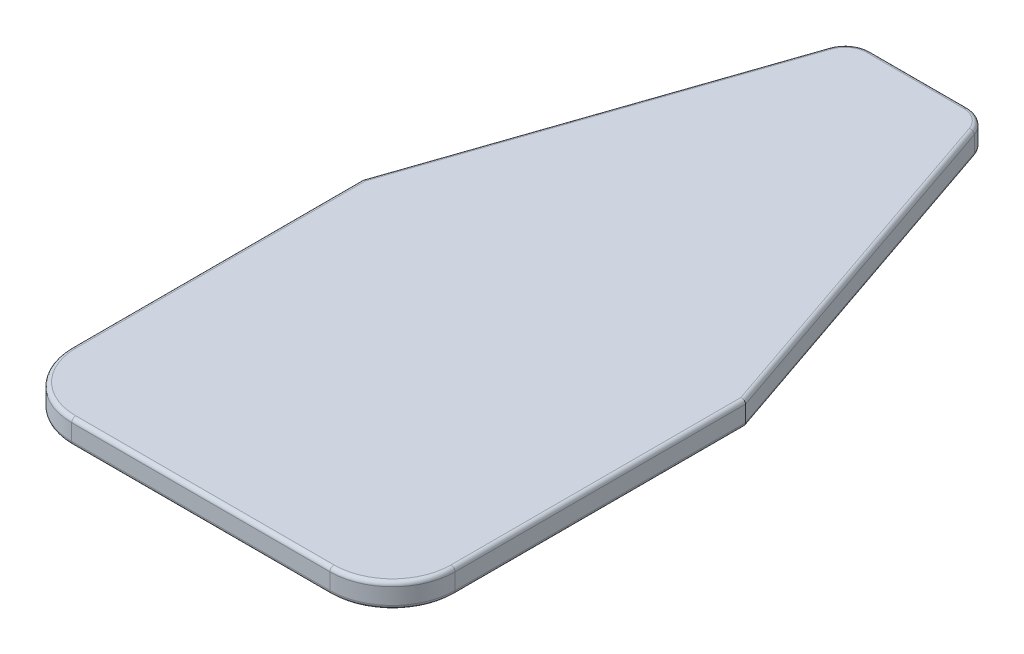
ISO-10303-21;
HEADER;
FILE_DESCRIPTION(('STEP AP214'),'2;1');
FILE_NAME('part.step','',(''),(''),'','','');
FILE_SCHEMA(('AUTOMOTIVE_DESIGN { 1 0 10303 214 1 1 1 1 }'));
ENDSEC;
DATA;
#1=APPLICATION_CONTEXT('core data for automotive mechanical design processes');
#2=APPLICATION_PROTOCOL_DEFINITION('international standard','automotive_design',2000,#1);
#3=PRODUCT_CONTEXT('',#1,'mechanical');
#4=PRODUCT('Part','Part','',(#3));
#5=PRODUCT_RELATED_PRODUCT_CATEGORY('part','',(#4));
#6=PRODUCT_DEFINITION_FORMATION('','',#4);
#7=PRODUCT_DEFINITION_CONTEXT('part definition',#1,'design');
#8=PRODUCT_DEFINITION('design','',#6,#7);
#9=PRODUCT_DEFINITION_SHAPE('','',#8);
#10=(LENGTH_UNIT() NAMED_UNIT(*) SI_UNIT(.MILLI.,.METRE.));
#11=(NAMED_UNIT(*) PLANE_ANGLE_UNIT() SI_UNIT($,.RADIAN.));
#12=(NAMED_UNIT(*) SI_UNIT($,.STERADIAN.) SOLID_ANGLE_UNIT());
#13=UNCERTAINTY_MEASURE_WITH_UNIT(LENGTH_MEASURE(1.E-05),#10,'distance_accuracy_value','');
#14=(GEOMETRIC_REPRESENTATION_CONTEXT(3) GLOBAL_UNCERTAINTY_ASSIGNED_CONTEXT((#13)) GLOBAL_UNIT_ASSIGNED_CONTEXT((#10,
#11,#12)) REPRESENTATION_CONTEXT('',''));
#15=CARTESIAN_POINT('',(0.,0.,0.));
#16=DIRECTION('',(0.,0.,1.));
#17=DIRECTION('',(1.,0.,0.));
#18=AXIS2_PLACEMENT_3D('',#15,#16,#17);
#19=CARTESIAN_POINT('',(-101.6,19.05,-24.8480219094121));
#20=DIRECTION('',(0.,-1.,0.));
#21=DIRECTION('',(0.,0.,-1.));
#22=AXIS2_PLACEMENT_3D('',#19,#20,#21);
#23=CYLINDRICAL_SURFACE('',#22,49.2125);
#24=DIRECTION('',(0.,-1.,0.));
#25=VECTOR('',#24,1.);
#26=CARTESIAN_POINT('',(-150.8125,19.05,-24.8480219094121));
#27=LINE('',#26,#25);
#28=CARTESIAN_POINT('',(-150.8125,15.875,-24.8480219094121));
#29=VERTEX_POINT('',#28);
#30=CARTESIAN_POINT('',(-150.8125,3.17500000000001,-24.8480219094121));
#31=VERTEX_POINT('',#30);
#32=EDGE_CURVE('E203',#29,#31,#27,.T.);
#33=ORIENTED_EDGE('',*,*,#32,.T.);
#34=CARTESIAN_POINT('',(-101.6,3.175,-24.8480219094121));
#35=DIRECTION('',(0.,1.,0.));
#36=DIRECTION('',(0.,0.,1.));
#37=AXIS2_PLACEMENT_3D('',#34,#35,#36);
#38=CIRCLE('',#37,49.2125);
#39=CARTESIAN_POINT('',(-101.6,3.17500000000001,24.3644780905879));
#40=VERTEX_POINT('',#39);
#41=EDGE_CURVE('E243',#31,#40,#38,.T.);
#42=ORIENTED_EDGE('',*,*,#41,.T.);
#43=DIRECTION('',(0.,-1.,0.));
#44=VECTOR('',#43,1.);
#45=CARTESIAN_POINT('',(-101.6,19.05,24.3644780905879));
#46=LINE('',#45,#44);
#47=CARTESIAN_POINT('',(-101.6,15.875,24.3644780905879));
#48=VERTEX_POINT('',#47);
#49=EDGE_CURVE('E197',#48,#40,#46,.T.);
#50=ORIENTED_EDGE('',*,*,#49,.F.);
#51=CARTESIAN_POINT('',(-101.6,15.875,-24.8480219094121));
#52=DIRECTION('',(0.,1.,0.));
#53=DIRECTION('',(0.,0.,1.));
#54=AXIS2_PLACEMENT_3D('',#51,#52,#53);
#55=CIRCLE('',#54,49.2125);
#56=EDGE_CURVE('E311',#48,#29,#55,.F.);
#57=ORIENTED_EDGE('',*,*,#56,.T.);
#58=EDGE_LOOP('',(#33,#42,#50,#57));
#59=FACE_BOUND('',#58,.T.);
#60=ADVANCED_FACE('F36',(#59),#23,.T.);
#61=CARTESIAN_POINT('',(-101.6,19.05,24.3644780905879));
#62=DIRECTION('',(0.,0.,-1.));
#63=DIRECTION('',(-1.,0.,0.));
#64=AXIS2_PLACEMENT_3D('',#61,#62,#63);
#65=PLANE('',#64);
#66=ORIENTED_EDGE('',*,*,#49,.T.);
#67=DIRECTION('',(1.,0.,0.));
#68=VECTOR('',#67,1.);
#69=CARTESIAN_POINT('',(-101.6,3.175,24.3644780905879));
#70=LINE('',#69,#68);
#71=CARTESIAN_POINT('',(101.6,3.17500000000001,24.3644780905879));
#72=VERTEX_POINT('',#71);
#73=EDGE_CURVE('E11',#40,#72,#70,.T.);
#74=ORIENTED_EDGE('',*,*,#73,.T.);
#75=DIRECTION('',(0.,-1.,0.));
#76=VECTOR('',#75,1.);
#77=CARTESIAN_POINT('',(101.6,19.05,24.3644780905879));
#78=LINE('',#77,#76);
#79=CARTESIAN_POINT('',(101.6,15.875,24.3644780905879));
#80=VERTEX_POINT('',#79);
#81=EDGE_CURVE('E329',#80,#72,#78,.T.);
#82=ORIENTED_EDGE('',*,*,#81,.F.);
#83=DIRECTION('',(1.,0.,0.));
#84=VECTOR('',#83,1.);
#85=CARTESIAN_POINT('',(-101.6,15.875,24.3644780905879));
#86=LINE('',#85,#84);
#87=EDGE_CURVE('E308',#80,#48,#86,.F.);
#88=ORIENTED_EDGE('',*,*,#87,.T.);
#89=EDGE_LOOP('',(#66,#74,#82,#88));
#90=FACE_BOUND('',#89,.T.);
#91=ADVANCED_FACE('F426',(#90),#65,.F.);
#92=CARTESIAN_POINT('',(101.6,19.05,-24.8480219094121));
#93=DIRECTION('',(0.,-1.,0.));
#94=DIRECTION('',(0.,0.,-1.));
#95=AXIS2_PLACEMENT_3D('',#92,#93,#94);
#96=CYLINDRICAL_SURFACE('',#95,49.2125);
#97=ORIENTED_EDGE('',*,*,#81,.T.);
#98=CARTESIAN_POINT('',(101.6,3.175,-24.8480219094121));
#99=DIRECTION('',(0.,1.,0.));
#100=DIRECTION('',(0.,0.,1.));
#101=AXIS2_PLACEMENT_3D('',#98,#99,#100);
#102=CIRCLE('',#101,49.2125);
#103=CARTESIAN_POINT('',(150.8125,3.17500000000001,-24.8480219094121));
#104=VERTEX_POINT('',#103);
#105=EDGE_CURVE('E58',#72,#104,#102,.T.);
#106=ORIENTED_EDGE('',*,*,#105,.T.);
#107=DIRECTION('',(0.,-1.,0.));
#108=VECTOR('',#107,1.);
#109=CARTESIAN_POINT('',(150.8125,19.05,-24.8480219094121));
#110=LINE('',#109,#108);
#111=CARTESIAN_POINT('',(150.8125,15.875,-24.8480219094121));
#112=VERTEX_POINT('',#111);
#113=EDGE_CURVE('E325',#112,#104,#110,.T.);
#114=ORIENTED_EDGE('',*,*,#113,.F.);
#115=CARTESIAN_POINT('',(101.6,15.875,-24.8480219094121));
#116=DIRECTION('',(0.,1.,0.));
#117=DIRECTION('',(0.,0.,1.));
#118=AXIS2_PLACEMENT_3D('',#115,#116,#117);
#119=CIRCLE('',#118,49.2125);
#120=EDGE_CURVE('E200',#112,#80,#119,.F.);
#121=ORIENTED_EDGE('',*,*,#120,.T.);
#122=EDGE_LOOP('',(#97,#106,#114,#121));
#123=FACE_BOUND('',#122,.T.);
#124=ADVANCED_FACE('F328',(#123),#96,.T.);
#125=CARTESIAN_POINT('',(150.8125,19.05,-24.8480219094121));
#126=DIRECTION('',(-1.,0.,0.));
#127=DIRECTION('',(0.,0.,1.));
#128=AXIS2_PLACEMENT_3D('',#125,#126,#127);
#129=PLANE('',#128);
#130=ORIENTED_EDGE('',*,*,#113,.T.);
#131=DIRECTION('',(0.,0.,-1.));
#132=VECTOR('',#131,1.);
#133=CARTESIAN_POINT('',(150.8125,3.175,-24.8480219094121));
#134=LINE('',#133,#132);
#135=CARTESIAN_POINT('',(150.8125,3.17500000000001,-253.448021909412));
#136=VERTEX_POINT('',#135);
#137=EDGE_CURVE('E245',#104,#136,#134,.T.);
#138=ORIENTED_EDGE('',*,*,#137,.T.);
#139=DIRECTION('',(0.,-1.,0.));
#140=VECTOR('',#139,1.);
#141=CARTESIAN_POINT('',(150.8125,19.05,-253.448021909412));
#142=LINE('',#141,#140);
#143=CARTESIAN_POINT('',(150.8125,15.875,-253.448021909412));
#144=VERTEX_POINT('',#143);
#145=EDGE_CURVE('E327',#144,#136,#142,.T.);
#146=ORIENTED_EDGE('',*,*,#145,.F.);
#147=DIRECTION('',(0.,0.,-1.));
#148=VECTOR('',#147,1.);
#149=CARTESIAN_POINT('',(150.8125,15.875,-24.8480219094121));
#150=LINE('',#149,#148);
#151=EDGE_CURVE('E214',#144,#112,#150,.F.);
#152=ORIENTED_EDGE('',*,*,#151,.T.);
#153=EDGE_LOOP('',(#130,#138,#146,#152));
#154=FACE_BOUND('',#153,.T.);
#155=ADVANCED_FACE('F324',(#154),#129,.F.);
#156=CARTESIAN_POINT('',(150.8125,19.05,-253.448021909412));
#157=DIRECTION('',(-0.946141878412051,0.,0.323752290980182));
#158=DIRECTION('',(0.323752290980182,0.,0.946141878412051));
#159=AXIS2_PLACEMENT_3D('',#156,#157,#158);
#160=PLANE('',#159);
#161=ORIENTED_EDGE('',*,*,#145,.T.);
#162=DIRECTION('',(-0.323752290980182,0.,-0.946141878412051));
#163=VECTOR('',#162,1.);
#164=CARTESIAN_POINT('',(150.8125,3.175,-253.448021909412));
#165=LINE('',#164,#163);
#166=CARTESIAN_POINT('',(57.15,3.17500000000001,-527.169679348412));
#167=VERTEX_POINT('',#166);
#168=EDGE_CURVE('E210',#136,#167,#165,.T.);
#169=ORIENTED_EDGE('',*,*,#168,.T.);
#170=DIRECTION('',(0.,-1.,0.));
#171=VECTOR('',#170,1.);
#172=CARTESIAN_POINT('',(57.15,19.05,-527.169679348412));
#173=LINE('',#172,#171);
#174=CARTESIAN_POINT('',(57.15,15.875,-527.169679348412));
#175=VERTEX_POINT('',#174);
#176=EDGE_CURVE('E332',#175,#167,#173,.T.);
#177=ORIENTED_EDGE('',*,*,#176,.F.);
#178=DIRECTION('',(-0.323752290980182,0.,-0.946141878412051));
#179=VECTOR('',#178,1.);
#180=CARTESIAN_POINT('',(150.8125,15.875,-253.448021909412));
#181=LINE('',#180,#179);
#182=EDGE_CURVE('E313',#175,#144,#181,.F.);
#183=ORIENTED_EDGE('',*,*,#182,.T.);
#184=EDGE_LOOP('',(#161,#169,#177,#183));
#185=FACE_BOUND('',#184,.T.);
#186=ADVANCED_FACE('F412',(#185),#160,.F.);
#187=CARTESIAN_POINT('',(38.1,19.05,-520.651120891277));
#188=DIRECTION('',(0.,-1.,0.));
#189=DIRECTION('',(0.,0.,-1.));
#190=AXIS2_PLACEMENT_3D('',#187,#188,#189);
#191=CYLINDRICAL_SURFACE('',#190,20.1344010181353);
#192=ORIENTED_EDGE('',*,*,#176,.T.);
#193=CARTESIAN_POINT('',(38.1,3.175,-520.651120891277));
#194=DIRECTION('',(0.,1.,0.));
#195=DIRECTION('',(0.,0.,1.));
#196=AXIS2_PLACEMENT_3D('',#193,#194,#195);
#197=CIRCLE('',#196,20.1344010181353);
#198=CARTESIAN_POINT('',(38.1,3.17500000000001,-540.785521909412));
#199=VERTEX_POINT('',#198);
#200=EDGE_CURVE('E235',#167,#199,#197,.T.);
#201=ORIENTED_EDGE('',*,*,#200,.T.);
#202=DIRECTION('',(0.,-1.,0.));
#203=VECTOR('',#202,1.);
#204=CARTESIAN_POINT('',(38.1,19.05,-540.785521909412));
#205=LINE('',#204,#203);
#206=CARTESIAN_POINT('',(38.1,15.875,-540.785521909412));
#207=VERTEX_POINT('',#206);
#208=EDGE_CURVE('E399',#207,#199,#205,.T.);
#209=ORIENTED_EDGE('',*,*,#208,.F.);
#210=CARTESIAN_POINT('',(38.1,15.875,-520.651120891277));
#211=DIRECTION('',(0.,1.,0.));
#212=DIRECTION('',(0.,0.,1.));
#213=AXIS2_PLACEMENT_3D('',#210,#211,#212);
#214=CIRCLE('',#213,20.1344010181353);
#215=EDGE_CURVE('E359',#207,#175,#214,.F.);
#216=ORIENTED_EDGE('',*,*,#215,.T.);
#217=EDGE_LOOP('',(#192,#201,#209,#216));
#218=FACE_BOUND('',#217,.T.);
#219=ADVANCED_FACE('F411',(#218),#191,.T.);
#220=CARTESIAN_POINT('',(-38.1,19.05,-540.785521909412));
#221=DIRECTION('',(0.,0.,1.));
#222=DIRECTION('',(1.,0.,0.));
#223=AXIS2_PLACEMENT_3D('',#220,#221,#222);
#224=PLANE('',#223);
#225=ORIENTED_EDGE('',*,*,#208,.T.);
#226=DIRECTION('',(-1.,0.,0.));
#227=VECTOR('',#226,1.);
#228=CARTESIAN_POINT('',(-38.1,3.175,-540.785521909412));
#229=LINE('',#228,#227);
#230=CARTESIAN_POINT('',(-38.1,3.17500000000001,-540.785521909412));
#231=VERTEX_POINT('',#230);
#232=EDGE_CURVE('E237',#199,#231,#229,.T.);
#233=ORIENTED_EDGE('',*,*,#232,.T.);
#234=DIRECTION('',(0.,-1.,0.));
#235=VECTOR('',#234,1.);
#236=CARTESIAN_POINT('',(-38.1,19.05,-540.785521909412));
#237=LINE('',#236,#235);
#238=CARTESIAN_POINT('',(-38.1,15.875,-540.785521909412));
#239=VERTEX_POINT('',#238);
#240=EDGE_CURVE('E391',#239,#231,#237,.T.);
#241=ORIENTED_EDGE('',*,*,#240,.F.);
#242=DIRECTION('',(-1.,0.,0.));
#243=VECTOR('',#242,1.);
#244=CARTESIAN_POINT('',(38.1,15.875,-540.785521909412));
#245=LINE('',#244,#243);
#246=EDGE_CURVE('E357',#239,#207,#245,.F.);
#247=ORIENTED_EDGE('',*,*,#246,.T.);
#248=EDGE_LOOP('',(#225,#233,#241,#247));
#249=FACE_BOUND('',#248,.T.);
#250=ADVANCED_FACE('F396',(#249),#224,.F.);
#251=CARTESIAN_POINT('',(-38.1,19.05,-520.651120891277));
#252=DIRECTION('',(0.,-1.,0.));
#253=DIRECTION('',(0.,0.,-1.));
#254=AXIS2_PLACEMENT_3D('',#251,#252,#253);
#255=CYLINDRICAL_SURFACE('',#254,20.1344010181353);
#256=ORIENTED_EDGE('',*,*,#240,.T.);
#257=CARTESIAN_POINT('',(-38.1,3.175,-520.651120891277));
#258=DIRECTION('',(0.,1.,0.));
#259=DIRECTION('',(0.,0.,1.));
#260=AXIS2_PLACEMENT_3D('',#257,#258,#259);
#261=CIRCLE('',#260,20.1344010181353);
#262=CARTESIAN_POINT('',(-57.15,3.17500000000001,-527.169679348412));
#263=VERTEX_POINT('',#262);
#264=EDGE_CURVE('E239',#231,#263,#261,.T.);
#265=ORIENTED_EDGE('',*,*,#264,.T.);
#266=DIRECTION('',(0.,-1.,0.));
#267=VECTOR('',#266,1.);
#268=CARTESIAN_POINT('',(-57.15,19.05,-527.169679348412));
#269=LINE('',#268,#267);
#270=CARTESIAN_POINT('',(-57.15,15.875,-527.169679348412));
#271=VERTEX_POINT('',#270);
#272=EDGE_CURVE('E375',#271,#263,#269,.T.);
#273=ORIENTED_EDGE('',*,*,#272,.F.);
#274=CARTESIAN_POINT('',(-38.1,15.875,-520.651120891277));
#275=DIRECTION('',(0.,1.,0.));
#276=DIRECTION('',(0.,0.,1.));
#277=AXIS2_PLACEMENT_3D('',#274,#275,#276);
#278=CIRCLE('',#277,20.1344010181353);
#279=EDGE_CURVE('E355',#271,#239,#278,.F.);
#280=ORIENTED_EDGE('',*,*,#279,.T.);
#281=EDGE_LOOP('',(#256,#265,#273,#280));
#282=FACE_BOUND('',#281,.T.);
#283=ADVANCED_FACE('F390',(#282),#255,.T.);
#284=CARTESIAN_POINT('',(-150.8125,19.05,-253.448021909412));
#285=DIRECTION('',(0.946141878412051,0.,0.323752290980182));
#286=DIRECTION('',(0.323752290980182,0.,-0.946141878412051));
#287=AXIS2_PLACEMENT_3D('',#284,#285,#286);
#288=PLANE('',#287);
#289=ORIENTED_EDGE('',*,*,#272,.T.);
#290=DIRECTION('',(-0.323752290980182,0.,0.946141878412051));
#291=VECTOR('',#290,1.);
#292=CARTESIAN_POINT('',(-150.8125,3.175,-253.448021909412));
#293=LINE('',#292,#291);
#294=CARTESIAN_POINT('',(-150.8125,3.17500000000001,-253.448021909412));
#295=VERTEX_POINT('',#294);
#296=EDGE_CURVE('E45',#263,#295,#293,.T.);
#297=ORIENTED_EDGE('',*,*,#296,.T.);
#298=DIRECTION('',(0.,-1.,0.));
#299=VECTOR('',#298,1.);
#300=CARTESIAN_POINT('',(-150.8125,19.05,-253.448021909412));
#301=LINE('',#300,#299);
#302=CARTESIAN_POINT('',(-150.8125,15.875,-253.448021909412));
#303=VERTEX_POINT('',#302);
#304=EDGE_CURVE('E366',#303,#295,#301,.T.);
#305=ORIENTED_EDGE('',*,*,#304,.F.);
#306=DIRECTION('',(-0.323752290980182,0.,0.946141878412051));
#307=VECTOR('',#306,1.);
#308=CARTESIAN_POINT('',(-57.15,15.875,-527.169679348412));
#309=LINE('',#308,#307);
#310=EDGE_CURVE('E352',#303,#271,#309,.F.);
#311=ORIENTED_EDGE('',*,*,#310,.T.);
#312=EDGE_LOOP('',(#289,#297,#305,#311));
#313=FACE_BOUND('',#312,.T.);
#314=ADVANCED_FACE('F373',(#313),#288,.F.);
#315=CARTESIAN_POINT('',(-150.8125,19.05,-24.8480219094121));
#316=DIRECTION('',(1.,0.,0.));
#317=DIRECTION('',(0.,0.,-1.));
#318=AXIS2_PLACEMENT_3D('',#315,#316,#317);
#319=PLANE('',#318);
#320=ORIENTED_EDGE('',*,*,#304,.T.);
#321=DIRECTION('',(0.,0.,1.));
#322=VECTOR('',#321,1.);
#323=CARTESIAN_POINT('',(-150.8125,3.175,-24.8480219094121));
#324=LINE('',#323,#322);
#325=EDGE_CURVE('E241',#295,#31,#324,.T.);
#326=ORIENTED_EDGE('',*,*,#325,.T.);
#327=ORIENTED_EDGE('',*,*,#32,.F.);
#328=DIRECTION('',(0.,0.,1.));
#329=VECTOR('',#328,1.);
#330=CARTESIAN_POINT('',(-150.8125,15.875,-253.448021909412));
#331=LINE('',#330,#329);
#332=EDGE_CURVE('E315',#29,#303,#331,.F.);
#333=ORIENTED_EDGE('',*,*,#332,.T.);
#334=EDGE_LOOP('',(#320,#326,#327,#333));
#335=FACE_BOUND('',#334,.T.);
#336=ADVANCED_FACE('F365',(#335),#319,.F.);
#337=CARTESIAN_POINT('',(-101.6,19.05,-24.8480219094121));
#338=DIRECTION('',(0.,1.,0.));
#339=DIRECTION('',(0.,0.,1.));
#340=AXIS2_PLACEMENT_3D('',#337,#338,#339);
#341=PLANE('',#340);
#342=CARTESIAN_POINT('',(-38.1,19.05,-520.651120891277));
#343=DIRECTION('',(0.,1.,0.));
#344=DIRECTION('',(0.,0.,1.));
#345=AXIS2_PLACEMENT_3D('',#342,#343,#344);
#346=CIRCLE('',#345,16.9594010181352);
#347=CARTESIAN_POINT('',(-38.1,19.05,-537.610521909412));
#348=VERTEX_POINT('',#347);
#349=CARTESIAN_POINT('',(-54.1459995360417,19.05,-526.14176582455));
#350=VERTEX_POINT('',#349);
#351=EDGE_CURVE('E347',#348,#350,#346,.T.);
#352=ORIENTED_EDGE('',*,*,#351,.T.);
#353=DIRECTION('',(-0.323752290980182,0.,0.946141878412051));
#354=VECTOR('',#353,1.);
#355=CARTESIAN_POINT('',(-147.808499536042,19.05,-252.42010838555));
#356=LINE('',#355,#354);
#357=CARTESIAN_POINT('',(-147.6375,19.05,-252.919841751909));
#358=VERTEX_POINT('',#357);
#359=EDGE_CURVE('E349',#350,#358,#356,.T.);
#360=ORIENTED_EDGE('',*,*,#359,.T.);
#361=DIRECTION('',(0.,0.,1.));
#362=VECTOR('',#361,1.);
#363=CARTESIAN_POINT('',(-147.6375,19.05,-24.8480219094121));
#364=LINE('',#363,#362);
#365=CARTESIAN_POINT('',(-147.6375,19.05,-24.8480219094121));
#366=VERTEX_POINT('',#365);
#367=EDGE_CURVE('E341',#358,#366,#364,.T.);
#368=ORIENTED_EDGE('',*,*,#367,.T.);
#369=CARTESIAN_POINT('',(-101.6,19.05,-24.8480219094121));
#370=DIRECTION('',(0.,1.,0.));
#371=DIRECTION('',(0.,0.,1.));
#372=AXIS2_PLACEMENT_3D('',#369,#370,#371);
#373=CIRCLE('',#372,46.0375);
#374=CARTESIAN_POINT('',(-101.6,19.05,21.1894780905879));
#375=VERTEX_POINT('',#374);
#376=EDGE_CURVE('E339',#366,#375,#373,.T.);
#377=ORIENTED_EDGE('',*,*,#376,.T.);
#378=DIRECTION('',(1.,0.,0.));
#379=VECTOR('',#378,1.);
#380=CARTESIAN_POINT('',(101.6,19.05,21.1894780905879));
#381=LINE('',#380,#379);
#382=CARTESIAN_POINT('',(101.6,19.05,21.1894780905879));
#383=VERTEX_POINT('',#382);
#384=EDGE_CURVE('E181',#375,#383,#381,.T.);
#385=ORIENTED_EDGE('',*,*,#384,.T.);
#386=CARTESIAN_POINT('',(101.6,19.05,-24.8480219094121));
#387=DIRECTION('',(0.,1.,0.));
#388=DIRECTION('',(0.,0.,1.));
#389=AXIS2_PLACEMENT_3D('',#386,#387,#388);
#390=CIRCLE('',#389,46.0375);
#391=CARTESIAN_POINT('',(147.6375,19.05,-24.8480219094121));
#392=VERTEX_POINT('',#391);
#393=EDGE_CURVE('E175',#383,#392,#390,.T.);
#394=ORIENTED_EDGE('',*,*,#393,.T.);
#395=DIRECTION('',(0.,0.,-1.));
#396=VECTOR('',#395,1.);
#397=CARTESIAN_POINT('',(147.6375,19.05,-253.448021909412));
#398=LINE('',#397,#396);
#399=CARTESIAN_POINT('',(147.6375,19.05,-252.91984175191));
#400=VERTEX_POINT('',#399);
#401=EDGE_CURVE('E178',#392,#400,#398,.T.);
#402=ORIENTED_EDGE('',*,*,#401,.T.);
#403=DIRECTION('',(-0.323752290980182,0.,-0.946141878412051));
#404=VECTOR('',#403,1.);
#405=CARTESIAN_POINT('',(54.1459995360417,19.05,-526.14176582455));
#406=LINE('',#405,#404);
#407=CARTESIAN_POINT('',(54.1459995360418,19.05,-526.14176582455));
#408=VERTEX_POINT('',#407);
#409=EDGE_CURVE('E186',#400,#408,#406,.T.);
#410=ORIENTED_EDGE('',*,*,#409,.T.);
#411=CARTESIAN_POINT('',(38.1,19.05,-520.651120891277));
#412=DIRECTION('',(0.,1.,0.));
#413=DIRECTION('',(0.,0.,1.));
#414=AXIS2_PLACEMENT_3D('',#411,#412,#413);
#415=CIRCLE('',#414,16.9594010181352);
#416=CARTESIAN_POINT('',(38.1,19.05,-537.610521909412));
#417=VERTEX_POINT('',#416);
#418=EDGE_CURVE('E343',#408,#417,#415,.T.);
#419=ORIENTED_EDGE('',*,*,#418,.T.);
#420=DIRECTION('',(-1.,0.,0.));
#421=VECTOR('',#420,1.);
#422=CARTESIAN_POINT('',(-38.1,19.05,-537.610521909412));
#423=LINE('',#422,#421);
#424=EDGE_CURVE('E345',#417,#348,#423,.T.);
#425=ORIENTED_EDGE('',*,*,#424,.T.);
#426=EDGE_LOOP('',(#352,#360,#368,#377,#385,#394,#402,#410,#419,#425));
#427=FACE_BOUND('',#426,.T.);
#428=ADVANCED_FACE('F177',(#427),#341,.T.);
#429=CARTESIAN_POINT('',(-101.6,0.,-24.8480219094121));
#430=DIRECTION('',(0.,1.,0.));
#431=DIRECTION('',(0.,0.,1.));
#432=AXIS2_PLACEMENT_3D('',#429,#430,#431);
#433=PLANE('',#432);
#434=DIRECTION('',(-1.,0.,0.));
#435=VECTOR('',#434,1.);
#436=CARTESIAN_POINT('',(-101.6,0.,-537.610521909412));
#437=LINE('',#436,#435);
#438=CARTESIAN_POINT('',(-38.1,0.,-537.610521909412));
#439=VERTEX_POINT('',#438);
#440=CARTESIAN_POINT('',(38.1,0.,-537.610521909412));
#441=VERTEX_POINT('',#440);
#442=EDGE_CURVE('E231',#439,#441,#437,.F.);
#443=ORIENTED_EDGE('',*,*,#442,.T.);
#444=CARTESIAN_POINT('',(38.1,0.,-520.651120891277));
#445=DIRECTION('',(0.,1.,0.));
#446=DIRECTION('',(0.,0.,1.));
#447=AXIS2_PLACEMENT_3D('',#444,#445,#446);
#448=CIRCLE('',#447,16.9594010181352);
#449=CARTESIAN_POINT('',(54.1459995360417,0.,-526.14176582455));
#450=VERTEX_POINT('',#449);
#451=EDGE_CURVE('E233',#441,#450,#448,.F.);
#452=ORIENTED_EDGE('',*,*,#451,.T.);
#453=DIRECTION('',(-0.323752290980182,0.,-0.946141878412051));
#454=VECTOR('',#453,1.);
#455=CARTESIAN_POINT('',(191.375491879258,0.,-125.098828750505));
#456=LINE('',#455,#454);
#457=CARTESIAN_POINT('',(147.6375,0.,-252.91984175191));
#458=VERTEX_POINT('',#457);
#459=EDGE_CURVE('E224',#450,#458,#456,.F.);
#460=ORIENTED_EDGE('',*,*,#459,.T.);
#461=DIRECTION('',(0.,0.,-1.));
#462=VECTOR('',#461,1.);
#463=CARTESIAN_POINT('',(147.6375,0.,-24.8480219094121));
#464=LINE('',#463,#462);
#465=CARTESIAN_POINT('',(147.6375,0.,-24.8480219094121));
#466=VERTEX_POINT('',#465);
#467=EDGE_CURVE('E218',#458,#466,#464,.F.);
#468=ORIENTED_EDGE('',*,*,#467,.T.);
#469=CARTESIAN_POINT('',(101.6,0.,-24.8480219094121));
#470=DIRECTION('',(0.,1.,0.));
#471=DIRECTION('',(0.,0.,1.));
#472=AXIS2_PLACEMENT_3D('',#469,#470,#471);
#473=CIRCLE('',#472,46.0375);
#474=CARTESIAN_POINT('',(101.6,0.,21.1894780905879));
#475=VERTEX_POINT('',#474);
#476=EDGE_CURVE('E216',#466,#475,#473,.F.);
#477=ORIENTED_EDGE('',*,*,#476,.T.);
#478=DIRECTION('',(1.,0.,0.));
#479=VECTOR('',#478,1.);
#480=CARTESIAN_POINT('',(-101.6,0.,21.1894780905879));
#481=LINE('',#480,#479);
#482=CARTESIAN_POINT('',(-101.6,0.,21.1894780905879));
#483=VERTEX_POINT('',#482);
#484=EDGE_CURVE('E213',#475,#483,#481,.F.);
#485=ORIENTED_EDGE('',*,*,#484,.T.);
#486=CARTESIAN_POINT('',(-101.6,0.,-24.8480219094121));
#487=DIRECTION('',(0.,1.,0.));
#488=DIRECTION('',(0.,0.,1.));
#489=AXIS2_PLACEMENT_3D('',#486,#487,#488);
#490=CIRCLE('',#489,46.0375);
#491=CARTESIAN_POINT('',(-147.6375,0.,-24.8480219094121));
#492=VERTEX_POINT('',#491);
#493=EDGE_CURVE('E220',#483,#492,#490,.F.);
#494=ORIENTED_EDGE('',*,*,#493,.T.);
#495=DIRECTION('',(0.,0.,1.));
#496=VECTOR('',#495,1.);
#497=CARTESIAN_POINT('',(-147.6375,0.,-24.8480219094121));
#498=LINE('',#497,#496);
#499=CARTESIAN_POINT('',(-147.6375,0.,-252.91984175191));
#500=VERTEX_POINT('',#499);
#501=EDGE_CURVE('E222',#492,#500,#498,.F.);
#502=ORIENTED_EDGE('',*,*,#501,.T.);
#503=DIRECTION('',(-0.323752290980182,0.,0.946141878412051));
#504=VECTOR('',#503,1.);
#505=CARTESIAN_POINT('',(-212.674010809169,0.,-62.8554986825361));
#506=LINE('',#505,#504);
#507=CARTESIAN_POINT('',(-54.1459995360418,0.,-526.14176582455));
#508=VERTEX_POINT('',#507);
#509=EDGE_CURVE('E227',#500,#508,#506,.F.);
#510=ORIENTED_EDGE('',*,*,#509,.T.);
#511=CARTESIAN_POINT('',(-38.1,0.,-520.651120891277));
#512=DIRECTION('',(0.,1.,0.));
#513=DIRECTION('',(0.,0.,1.));
#514=AXIS2_PLACEMENT_3D('',#511,#512,#513);
#515=CIRCLE('',#514,16.9594010181352);
#516=EDGE_CURVE('E229',#508,#439,#515,.F.);
#517=ORIENTED_EDGE('',*,*,#516,.T.);
#518=EDGE_LOOP('',(#443,#452,#460,#468,#477,#485,#494,#502,#510,#517));
#519=FACE_BOUND('',#518,.T.);
#520=ADVANCED_FACE('F423',(#519),#433,.F.);
#521=CARTESIAN_POINT('',(147.6375,15.875,-24.8480219094121));
#522=DIRECTION('',(0.,0.,1.));
#523=DIRECTION('',(1.,0.,0.));
#524=AXIS2_PLACEMENT_3D('',#521,#522,#523);
#525=CYLINDRICAL_SURFACE('',#524,3.175);
#526=CARTESIAN_POINT('',(147.6375,15.875,-24.8480219094121));
#527=DIRECTION('',(0.,0.,1.));
#528=DIRECTION('',(1.,0.,0.));
#529=AXIS2_PLACEMENT_3D('',#526,#527,#528);
#530=CIRCLE('',#529,3.175);
#531=EDGE_CURVE('E192',#112,#392,#530,.T.);
#532=ORIENTED_EDGE('',*,*,#531,.F.);
#533=ORIENTED_EDGE('',*,*,#151,.F.);
#534=CARTESIAN_POINT('',(147.6375,15.875,-252.91984175191));
#535=DIRECTION('',(0.164100764148052,0.,0.986443581359839));
#536=DIRECTION('',(-0.986443581359839,0.,0.164100764148052));
#537=AXIS2_PLACEMENT_3D('',#534,#535,#536);
#538=ELLIPSE('',#537,3.2186331382715,3.175);
#539=EDGE_CURVE('E195',#400,#144,#538,.F.);
#540=ORIENTED_EDGE('',*,*,#539,.F.);
#541=ORIENTED_EDGE('',*,*,#401,.F.);
#542=EDGE_LOOP('',(#532,#533,#540,#541));
#543=FACE_BOUND('',#542,.T.);
#544=ADVANCED_FACE('F190',(#543),#525,.T.);
#545=CARTESIAN_POINT('',(191.375491879258,15.875,-125.098828750505));
#546=DIRECTION('',(0.323752290980182,0.,0.946141878412051));
#547=DIRECTION('',(0.946141878412051,0.,-0.323752290980182));
#548=AXIS2_PLACEMENT_3D('',#545,#546,#547);
#549=CYLINDRICAL_SURFACE('',#548,3.175);
#550=ORIENTED_EDGE('',*,*,#539,.T.);
#551=ORIENTED_EDGE('',*,*,#182,.F.);
#552=CARTESIAN_POINT('',(54.1459995360418,15.875,-526.14176582455));
#553=DIRECTION('',(-0.323752290980197,0.,-0.946141878412046));
#554=DIRECTION('',(-0.946141878412046,0.,0.323752290980197));
#555=AXIS2_PLACEMENT_3D('',#552,#553,#554);
#556=CIRCLE('',#555,3.175);
#557=EDGE_CURVE('E201',#408,#175,#556,.T.);
#558=ORIENTED_EDGE('',*,*,#557,.F.);
#559=ORIENTED_EDGE('',*,*,#409,.F.);
#560=EDGE_LOOP('',(#550,#551,#558,#559));
#561=FACE_BOUND('',#560,.T.);
#562=ADVANCED_FACE('F415',(#561),#549,.T.);
#563=CARTESIAN_POINT('',(101.6,15.875,-24.8480219094121));
#564=DIRECTION('',(0.,1.,0.));
#565=DIRECTION('',(0.,0.,1.));
#566=AXIS2_PLACEMENT_3D('',#563,#564,#565);
#567=TOROIDAL_SURFACE('',#566,46.0375,3.175);
#568=ORIENTED_EDGE('',*,*,#531,.T.);
#569=ORIENTED_EDGE('',*,*,#393,.F.);
#570=CARTESIAN_POINT('',(101.6,15.875,21.1894780905879));
#571=DIRECTION('',(-1.,0.,0.));
#572=DIRECTION('',(0.,0.,1.));
#573=AXIS2_PLACEMENT_3D('',#570,#571,#572);
#574=CIRCLE('',#573,3.175);
#575=EDGE_CURVE('E206',#80,#383,#574,.T.);
#576=ORIENTED_EDGE('',*,*,#575,.F.);
#577=ORIENTED_EDGE('',*,*,#120,.F.);
#578=EDGE_LOOP('',(#568,#569,#576,#577));
#579=FACE_BOUND('',#578,.T.);
#580=ADVANCED_FACE('F199',(#579),#567,.T.);
#581=CARTESIAN_POINT('',(38.1,15.875,-520.651120891277));
#582=DIRECTION('',(0.,1.,0.));
#583=DIRECTION('',(0.,0.,1.));
#584=AXIS2_PLACEMENT_3D('',#581,#582,#583);
#585=TOROIDAL_SURFACE('',#584,16.9594010181352,3.175);
#586=ORIENTED_EDGE('',*,*,#557,.T.);
#587=ORIENTED_EDGE('',*,*,#215,.F.);
#588=CARTESIAN_POINT('',(38.1,15.875,-537.610521909412));
#589=DIRECTION('',(-1.,0.,0.));
#590=DIRECTION('',(0.,0.,1.));
#591=AXIS2_PLACEMENT_3D('',#588,#589,#590);
#592=CIRCLE('',#591,3.175);
#593=EDGE_CURVE('E302',#417,#207,#592,.T.);
#594=ORIENTED_EDGE('',*,*,#593,.F.);
#595=ORIENTED_EDGE('',*,*,#418,.F.);
#596=EDGE_LOOP('',(#586,#587,#594,#595));
#597=FACE_BOUND('',#596,.T.);
#598=ADVANCED_FACE('F407',(#597),#585,.T.);
#599=CARTESIAN_POINT('',(-101.6,15.875,21.1894780905879));
#600=DIRECTION('',(-1.,0.,0.));
#601=DIRECTION('',(0.,0.,1.));
#602=AXIS2_PLACEMENT_3D('',#599,#600,#601);
#603=CYLINDRICAL_SURFACE('',#602,3.175);
#604=ORIENTED_EDGE('',*,*,#575,.T.);
#605=ORIENTED_EDGE('',*,*,#384,.F.);
#606=CARTESIAN_POINT('',(-101.6,15.875,21.1894780905879));
#607=DIRECTION('',(-1.,0.,0.));
#608=DIRECTION('',(0.,0.,1.));
#609=AXIS2_PLACEMENT_3D('',#606,#607,#608);
#610=CIRCLE('',#609,3.175);
#611=EDGE_CURVE('E299',#48,#375,#610,.T.);
#612=ORIENTED_EDGE('',*,*,#611,.F.);
#613=ORIENTED_EDGE('',*,*,#87,.F.);
#614=EDGE_LOOP('',(#604,#605,#612,#613));
#615=FACE_BOUND('',#614,.T.);
#616=ADVANCED_FACE('F306',(#615),#603,.T.);
#617=CARTESIAN_POINT('',(-101.6,15.875,-537.610521909412));
#618=DIRECTION('',(1.,0.,0.));
#619=DIRECTION('',(0.,0.,-1.));
#620=AXIS2_PLACEMENT_3D('',#617,#618,#619);
#621=CYLINDRICAL_SURFACE('',#620,3.175);
#622=ORIENTED_EDGE('',*,*,#593,.T.);
#623=ORIENTED_EDGE('',*,*,#246,.F.);
#624=CARTESIAN_POINT('',(-38.1,15.875,-537.610521909412));
#625=DIRECTION('',(-1.,0.,0.));
#626=DIRECTION('',(0.,0.,1.));
#627=AXIS2_PLACEMENT_3D('',#624,#625,#626);
#628=CIRCLE('',#627,3.175);
#629=EDGE_CURVE('E296',#348,#239,#628,.T.);
#630=ORIENTED_EDGE('',*,*,#629,.F.);
#631=ORIENTED_EDGE('',*,*,#424,.F.);
#632=EDGE_LOOP('',(#622,#623,#630,#631));
#633=FACE_BOUND('',#632,.T.);
#634=ADVANCED_FACE('F402',(#633),#621,.T.);
#635=CARTESIAN_POINT('',(-101.6,15.875,-24.8480219094121));
#636=DIRECTION('',(0.,1.,0.));
#637=DIRECTION('',(0.,0.,1.));
#638=AXIS2_PLACEMENT_3D('',#635,#636,#637);
#639=TOROIDAL_SURFACE('',#638,46.0375,3.175);
#640=ORIENTED_EDGE('',*,*,#611,.T.);
#641=ORIENTED_EDGE('',*,*,#376,.F.);
#642=CARTESIAN_POINT('',(-147.6375,15.875,-24.8480219094121));
#643=DIRECTION('',(0.,0.,-1.));
#644=DIRECTION('',(-1.,0.,0.));
#645=AXIS2_PLACEMENT_3D('',#642,#643,#644);
#646=CIRCLE('',#645,3.175);
#647=EDGE_CURVE('E289',#29,#366,#646,.T.);
#648=ORIENTED_EDGE('',*,*,#647,.F.);
#649=ORIENTED_EDGE('',*,*,#56,.F.);
#650=EDGE_LOOP('',(#640,#641,#648,#649));
#651=FACE_BOUND('',#650,.T.);
#652=ADVANCED_FACE('F441',(#651),#639,.T.);
#653=CARTESIAN_POINT('',(-38.1,15.875,-520.651120891277));
#654=DIRECTION('',(0.,1.,0.));
#655=DIRECTION('',(0.,0.,1.));
#656=AXIS2_PLACEMENT_3D('',#653,#654,#655);
#657=TOROIDAL_SURFACE('',#656,16.9594010181352,3.175);
#658=ORIENTED_EDGE('',*,*,#629,.T.);
#659=ORIENTED_EDGE('',*,*,#279,.F.);
#660=CARTESIAN_POINT('',(-54.1459995360417,15.875,-526.14176582455));
#661=DIRECTION('',(-0.323752290980192,0.,0.946141878412047));
#662=DIRECTION('',(0.946141878412047,0.,0.323752290980192));
#663=AXIS2_PLACEMENT_3D('',#660,#661,#662);
#664=CIRCLE('',#663,3.175);
#665=EDGE_CURVE('E282',#350,#271,#664,.T.);
#666=ORIENTED_EDGE('',*,*,#665,.F.);
#667=ORIENTED_EDGE('',*,*,#351,.F.);
#668=EDGE_LOOP('',(#658,#659,#666,#667));
#669=FACE_BOUND('',#668,.T.);
#670=ADVANCED_FACE('F386',(#669),#657,.T.);
#671=CARTESIAN_POINT('',(-147.6375,15.875,-24.8480219094121));
#672=DIRECTION('',(0.,0.,-1.));
#673=DIRECTION('',(-1.,0.,0.));
#674=AXIS2_PLACEMENT_3D('',#671,#672,#673);
#675=CYLINDRICAL_SURFACE('',#674,3.175);
#676=ORIENTED_EDGE('',*,*,#647,.T.);
#677=ORIENTED_EDGE('',*,*,#367,.F.);
#678=CARTESIAN_POINT('',(-147.6375,15.875,-252.919841751909));
#679=DIRECTION('',(0.164100764148052,0.,-0.986443581359839));
#680=DIRECTION('',(-0.986443581359839,0.,-0.164100764148052));
#681=AXIS2_PLACEMENT_3D('',#678,#679,#680);
#682=ELLIPSE('',#681,3.2186331382715,3.175);
#683=EDGE_CURVE('E277',#303,#358,#682,.T.);
#684=ORIENTED_EDGE('',*,*,#683,.F.);
#685=ORIENTED_EDGE('',*,*,#332,.F.);
#686=EDGE_LOOP('',(#676,#677,#684,#685));
#687=FACE_BOUND('',#686,.T.);
#688=ADVANCED_FACE('F380',(#687),#675,.T.);
#689=CARTESIAN_POINT('',(-212.674010809169,15.875,-62.8554986825361));
#690=DIRECTION('',(0.323752290980182,0.,-0.946141878412051));
#691=DIRECTION('',(-0.946141878412051,0.,-0.323752290980182));
#692=AXIS2_PLACEMENT_3D('',#689,#690,#691);
#693=CYLINDRICAL_SURFACE('',#692,3.175);
#694=ORIENTED_EDGE('',*,*,#665,.T.);
#695=ORIENTED_EDGE('',*,*,#310,.F.);
#696=ORIENTED_EDGE('',*,*,#683,.T.);
#697=ORIENTED_EDGE('',*,*,#359,.F.);
#698=EDGE_LOOP('',(#694,#695,#696,#697));
#699=FACE_BOUND('',#698,.T.);
#700=ADVANCED_FACE('F377',(#699),#693,.T.);
#701=CARTESIAN_POINT('',(-147.6375,3.175,-24.8480219094121));
#702=DIRECTION('',(0.,0.,1.));
#703=DIRECTION('',(1.,0.,0.));
#704=AXIS2_PLACEMENT_3D('',#701,#702,#703);
#705=CYLINDRICAL_SURFACE('',#704,3.175);
#706=CARTESIAN_POINT('',(-147.6375,3.175,-252.919841751909));
#707=DIRECTION('',(-0.164100764148052,0.,0.986443581359839));
#708=DIRECTION('',(-0.986443581359839,0.,-0.164100764148052));
#709=AXIS2_PLACEMENT_3D('',#706,#707,#708);
#710=ELLIPSE('',#709,3.2186331382715,3.175);
#711=EDGE_CURVE('E270',#500,#295,#710,.F.);
#712=ORIENTED_EDGE('',*,*,#711,.F.);
#713=ORIENTED_EDGE('',*,*,#501,.F.);
#714=CARTESIAN_POINT('',(-147.6375,3.175,-24.8480219094121));
#715=DIRECTION('',(0.,0.,1.));
#716=DIRECTION('',(1.,0.,0.));
#717=AXIS2_PLACEMENT_3D('',#714,#715,#716);
#718=CIRCLE('',#717,3.175);
#719=EDGE_CURVE('E40',#31,#492,#718,.T.);
#720=ORIENTED_EDGE('',*,*,#719,.F.);
#721=ORIENTED_EDGE('',*,*,#325,.F.);
#722=EDGE_LOOP('',(#712,#713,#720,#721));
#723=FACE_BOUND('',#722,.T.);
#724=ADVANCED_FACE('F38',(#723),#705,.T.);
#725=CARTESIAN_POINT('',(-101.6,3.175,-24.8480219094121));
#726=DIRECTION('',(0.,1.,0.));
#727=DIRECTION('',(0.,0.,1.));
#728=AXIS2_PLACEMENT_3D('',#725,#726,#727);
#729=TOROIDAL_SURFACE('',#728,46.0375,3.175);
#730=ORIENTED_EDGE('',*,*,#719,.T.);
#731=ORIENTED_EDGE('',*,*,#493,.F.);
#732=CARTESIAN_POINT('',(-101.6,3.175,21.1894780905879));
#733=DIRECTION('',(1.,0.,0.));
#734=DIRECTION('',(0.,0.,-1.));
#735=AXIS2_PLACEMENT_3D('',#732,#733,#734);
#736=CIRCLE('',#735,3.175);
#737=EDGE_CURVE('E268',#40,#483,#736,.T.);
#738=ORIENTED_EDGE('',*,*,#737,.F.);
#739=ORIENTED_EDGE('',*,*,#41,.F.);
#740=EDGE_LOOP('',(#730,#731,#738,#739));
#741=FACE_BOUND('',#740,.T.);
#742=ADVANCED_FACE('F484',(#741),#729,.T.);
#743=CARTESIAN_POINT('',(-147.808499536042,3.175,-252.42010838555));
#744=DIRECTION('',(-0.323752290980182,0.,0.946141878412051));
#745=DIRECTION('',(0.946141878412051,0.,0.323752290980182));
#746=AXIS2_PLACEMENT_3D('',#743,#744,#745);
#747=CYLINDRICAL_SURFACE('',#746,3.175);
#748=ORIENTED_EDGE('',*,*,#711,.T.);
#749=ORIENTED_EDGE('',*,*,#296,.F.);
#750=CARTESIAN_POINT('',(-54.1459995360418,3.175,-526.14176582455));
#751=DIRECTION('',(0.323752290980194,0.,-0.946141878412046));
#752=DIRECTION('',(-0.946141878412046,0.,-0.323752290980194));
#753=AXIS2_PLACEMENT_3D('',#750,#751,#752);
#754=CIRCLE('',#753,3.175);
#755=EDGE_CURVE('E265',#508,#263,#754,.T.);
#756=ORIENTED_EDGE('',*,*,#755,.F.);
#757=ORIENTED_EDGE('',*,*,#509,.F.);
#758=EDGE_LOOP('',(#748,#749,#756,#757));
#759=FACE_BOUND('',#758,.T.);
#760=ADVANCED_FACE('F492',(#759),#747,.T.);
#761=CARTESIAN_POINT('',(-101.6,3.175,21.1894780905879));
#762=DIRECTION('',(1.,0.,0.));
#763=DIRECTION('',(0.,0.,-1.));
#764=AXIS2_PLACEMENT_3D('',#761,#762,#763);
#765=CYLINDRICAL_SURFACE('',#764,3.175);
#766=ORIENTED_EDGE('',*,*,#737,.T.);
#767=ORIENTED_EDGE('',*,*,#484,.F.);
#768=CARTESIAN_POINT('',(101.6,3.175,21.1894780905879));
#769=DIRECTION('',(1.,0.,0.));
#770=DIRECTION('',(0.,0.,-1.));
#771=AXIS2_PLACEMENT_3D('',#768,#769,#770);
#772=CIRCLE('',#771,3.175);
#773=EDGE_CURVE('E262',#72,#475,#772,.T.);
#774=ORIENTED_EDGE('',*,*,#773,.F.);
#775=ORIENTED_EDGE('',*,*,#73,.F.);
#776=EDGE_LOOP('',(#766,#767,#774,#775));
#777=FACE_BOUND('',#776,.T.);
#778=ADVANCED_FACE('F498',(#777),#765,.T.);
#779=CARTESIAN_POINT('',(-38.1,3.175,-520.651120891277));
#780=DIRECTION('',(0.,1.,0.));
#781=DIRECTION('',(0.,0.,1.));
#782=AXIS2_PLACEMENT_3D('',#779,#780,#781);
#783=TOROIDAL_SURFACE('',#782,16.9594010181352,3.175);
#784=ORIENTED_EDGE('',*,*,#755,.T.);
#785=ORIENTED_EDGE('',*,*,#264,.F.);
#786=CARTESIAN_POINT('',(-38.1,3.175,-537.610521909412));
#787=DIRECTION('',(1.,0.,0.));
#788=DIRECTION('',(0.,0.,-1.));
#789=AXIS2_PLACEMENT_3D('',#786,#787,#788);
#790=CIRCLE('',#789,3.175);
#791=EDGE_CURVE('E259',#439,#231,#790,.T.);
#792=ORIENTED_EDGE('',*,*,#791,.F.);
#793=ORIENTED_EDGE('',*,*,#516,.F.);
#794=EDGE_LOOP('',(#784,#785,#792,#793));
#795=FACE_BOUND('',#794,.T.);
#796=ADVANCED_FACE('F505',(#795),#783,.T.);
#797=CARTESIAN_POINT('',(101.6,3.175,-24.8480219094121));
#798=DIRECTION('',(0.,1.,0.));
#799=DIRECTION('',(0.,0.,1.));
#800=AXIS2_PLACEMENT_3D('',#797,#798,#799);
#801=TOROIDAL_SURFACE('',#800,46.0375,3.175);
#802=ORIENTED_EDGE('',*,*,#773,.T.);
#803=ORIENTED_EDGE('',*,*,#476,.F.);
#804=CARTESIAN_POINT('',(147.6375,3.175,-24.8480219094121));
#805=DIRECTION('',(0.,0.,-1.));
#806=DIRECTION('',(-1.,0.,0.));
#807=AXIS2_PLACEMENT_3D('',#804,#805,#806);
#808=CIRCLE('',#807,3.175);
#809=EDGE_CURVE('E256',#104,#466,#808,.T.);
#810=ORIENTED_EDGE('',*,*,#809,.F.);
#811=ORIENTED_EDGE('',*,*,#105,.F.);
#812=EDGE_LOOP('',(#802,#803,#810,#811));
#813=FACE_BOUND('',#812,.T.);
#814=ADVANCED_FACE('F513',(#813),#801,.T.);
#815=CARTESIAN_POINT('',(-38.1,3.175,-537.610521909412));
#816=DIRECTION('',(-1.,0.,0.));
#817=DIRECTION('',(0.,0.,1.));
#818=AXIS2_PLACEMENT_3D('',#815,#816,#817);
#819=CYLINDRICAL_SURFACE('',#818,3.175);
#820=ORIENTED_EDGE('',*,*,#791,.T.);
#821=ORIENTED_EDGE('',*,*,#232,.F.);
#822=CARTESIAN_POINT('',(38.1,3.175,-537.610521909412));
#823=DIRECTION('',(1.,0.,0.));
#824=DIRECTION('',(0.,0.,-1.));
#825=AXIS2_PLACEMENT_3D('',#822,#823,#824);
#826=CIRCLE('',#825,3.175);
#827=EDGE_CURVE('E253',#441,#199,#826,.T.);
#828=ORIENTED_EDGE('',*,*,#827,.F.);
#829=ORIENTED_EDGE('',*,*,#442,.F.);
#830=EDGE_LOOP('',(#820,#821,#828,#829));
#831=FACE_BOUND('',#830,.T.);
#832=ADVANCED_FACE('F521',(#831),#819,.T.);
#833=CARTESIAN_POINT('',(147.6375,3.175,-24.8480219094121));
#834=DIRECTION('',(0.,0.,-1.));
#835=DIRECTION('',(-1.,0.,0.));
#836=AXIS2_PLACEMENT_3D('',#833,#834,#835);
#837=CYLINDRICAL_SURFACE('',#836,3.175);
#838=ORIENTED_EDGE('',*,*,#809,.T.);
#839=ORIENTED_EDGE('',*,*,#467,.F.);
#840=CARTESIAN_POINT('',(147.6375,3.175,-252.91984175191));
#841=DIRECTION('',(-0.164100764148052,0.,-0.986443581359839));
#842=DIRECTION('',(0.986443581359839,0.,-0.164100764148052));
#843=AXIS2_PLACEMENT_3D('',#840,#841,#842);
#844=ELLIPSE('',#843,3.2186331382715,3.175);
#845=EDGE_CURVE('E251',#136,#458,#844,.T.);
#846=ORIENTED_EDGE('',*,*,#845,.F.);
#847=ORIENTED_EDGE('',*,*,#137,.F.);
#848=EDGE_LOOP('',(#838,#839,#846,#847));
#849=FACE_BOUND('',#848,.T.);
#850=ADVANCED_FACE('F529',(#849),#837,.T.);
#851=CARTESIAN_POINT('',(38.1,3.175,-520.651120891277));
#852=DIRECTION('',(0.,1.,0.));
#853=DIRECTION('',(0.,0.,1.));
#854=AXIS2_PLACEMENT_3D('',#851,#852,#853);
#855=TOROIDAL_SURFACE('',#854,16.9594010181352,3.175);
#856=ORIENTED_EDGE('',*,*,#827,.T.);
#857=ORIENTED_EDGE('',*,*,#200,.F.);
#858=CARTESIAN_POINT('',(54.1459995360417,3.175,-526.14176582455));
#859=DIRECTION('',(0.323752290980192,0.,0.946141878412047));
#860=DIRECTION('',(0.946141878412047,0.,-0.323752290980192));
#861=AXIS2_PLACEMENT_3D('',#858,#859,#860);
#862=CIRCLE('',#861,3.175);
#863=EDGE_CURVE('E249',#450,#167,#862,.T.);
#864=ORIENTED_EDGE('',*,*,#863,.F.);
#865=ORIENTED_EDGE('',*,*,#451,.F.);
#866=EDGE_LOOP('',(#856,#857,#864,#865));
#867=FACE_BOUND('',#866,.T.);
#868=ADVANCED_FACE('F537',(#867),#855,.T.);
#869=CARTESIAN_POINT('',(147.808499536042,3.175,-252.42010838555));
#870=DIRECTION('',(-0.323752290980182,0.,-0.946141878412051));
#871=DIRECTION('',(-0.946141878412051,0.,0.323752290980182));
#872=AXIS2_PLACEMENT_3D('',#869,#870,#871);
#873=CYLINDRICAL_SURFACE('',#872,3.175);
#874=ORIENTED_EDGE('',*,*,#845,.T.);
#875=ORIENTED_EDGE('',*,*,#459,.F.);
#876=ORIENTED_EDGE('',*,*,#863,.T.);
#877=ORIENTED_EDGE('',*,*,#168,.F.);
#878=EDGE_LOOP('',(#874,#875,#876,#877));
#879=FACE_BOUND('',#878,.T.);
#880=ADVANCED_FACE('F545',(#879),#873,.T.);
#881=CLOSED_SHELL('',(#60,#91,#124,#155,#186,#219,#250,#283,#314,#336,#428,#520,#544,#562,#580,
#598,#616,#634,#652,#670,#688,#700,#724,#742,#760,#778,#796,#814,#832,#850,#868,#880));
#882=MANIFOLD_SOLID_BREP('B2',#881);
#883=ADVANCED_BREP_SHAPE_REPRESENTATION('',(#18,#882),#14);
#884=SHAPE_DEFINITION_REPRESENTATION(#9,#883);
ENDSEC;
END-ISO-10303-21;
